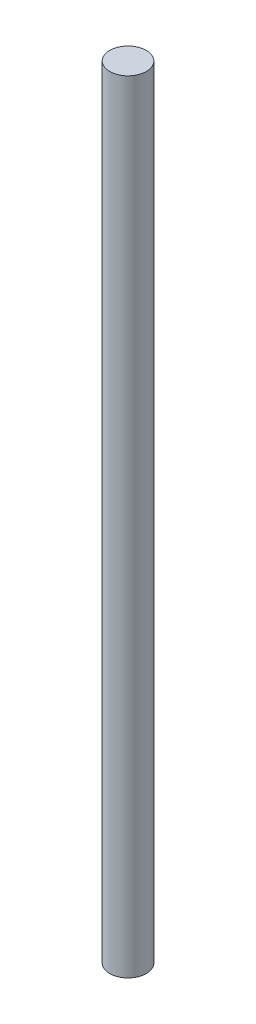
ISO-10303-21;
HEADER;
FILE_DESCRIPTION(('STEP AP214'),'2;1');
FILE_NAME('part.step','',(''),(''),'','','');
FILE_SCHEMA(('AUTOMOTIVE_DESIGN { 1 0 10303 214 1 1 1 1 }'));
ENDSEC;
DATA;
#1=APPLICATION_CONTEXT('core data for automotive mechanical design processes');
#2=APPLICATION_PROTOCOL_DEFINITION('international standard','automotive_design',2000,#1);
#3=PRODUCT_CONTEXT('',#1,'mechanical');
#4=PRODUCT('Part','Part','',(#3));
#5=PRODUCT_RELATED_PRODUCT_CATEGORY('part','',(#4));
#6=PRODUCT_DEFINITION_FORMATION('','',#4);
#7=PRODUCT_DEFINITION_CONTEXT('part definition',#1,'design');
#8=PRODUCT_DEFINITION('design','',#6,#7);
#9=PRODUCT_DEFINITION_SHAPE('','',#8);
#10=(LENGTH_UNIT() NAMED_UNIT(*) SI_UNIT(.MILLI.,.METRE.));
#11=(NAMED_UNIT(*) PLANE_ANGLE_UNIT() SI_UNIT($,.RADIAN.));
#12=(NAMED_UNIT(*) SI_UNIT($,.STERADIAN.) SOLID_ANGLE_UNIT());
#13=UNCERTAINTY_MEASURE_WITH_UNIT(LENGTH_MEASURE(1.E-05),#10,'distance_accuracy_value','');
#14=(GEOMETRIC_REPRESENTATION_CONTEXT(3) GLOBAL_UNCERTAINTY_ASSIGNED_CONTEXT((#13)) GLOBAL_UNIT_ASSIGNED_CONTEXT((#10,
#11,#12)) REPRESENTATION_CONTEXT('',''));
#15=CARTESIAN_POINT('',(0.,0.,0.));
#16=DIRECTION('',(0.,0.,1.));
#17=DIRECTION('',(1.,0.,0.));
#18=AXIS2_PLACEMENT_3D('',#15,#16,#17);
#19=CARTESIAN_POINT('',(0.,0.,0.));
#20=DIRECTION('',(0.,1.,0.));
#21=DIRECTION('',(0.,0.,1.));
#22=AXIS2_PLACEMENT_3D('',#19,#20,#21);
#23=PLANE('',#22);
#24=CARTESIAN_POINT('',(0.,0.,0.));
#25=DIRECTION('',(0.,-1.,0.));
#26=DIRECTION('',(0.,0.,-1.));
#27=AXIS2_PLACEMENT_3D('',#24,#25,#26);
#28=CIRCLE('',#27,1.1);
#29=CARTESIAN_POINT('',(0.,0.,-1.1));
#30=VERTEX_POINT('',#29);
#31=EDGE_CURVE('E10',#30,#30,#28,.T.);
#32=ORIENTED_EDGE('',*,*,#31,.F.);
#33=EDGE_LOOP('',(#32));
#34=FACE_BOUND('',#33,.T.);
#35=ADVANCED_FACE('F31',(#34),#23,.T.);
#36=CARTESIAN_POINT('',(0.,-51.,0.));
#37=DIRECTION('',(0.,-1.,0.));
#38=DIRECTION('',(0.,0.,-1.));
#39=AXIS2_PLACEMENT_3D('',#36,#37,#38);
#40=CYLINDRICAL_SURFACE('',#39,1.1);
#41=ORIENTED_EDGE('',*,*,#31,.T.);
#42=EDGE_LOOP('',(#41));
#43=FACE_BOUND('',#42,.T.);
#44=CARTESIAN_POINT('',(0.,-47.,0.));
#45=DIRECTION('',(0.,-1.,0.));
#46=DIRECTION('',(0.,0.,-1.));
#47=AXIS2_PLACEMENT_3D('',#44,#45,#46);
#48=CIRCLE('',#47,1.1);
#49=CARTESIAN_POINT('',(0.,-47.,-1.1));
#50=VERTEX_POINT('',#49);
#51=EDGE_CURVE('E37',#50,#50,#48,.T.);
#52=ORIENTED_EDGE('',*,*,#51,.F.);
#53=EDGE_LOOP('',(#52));
#54=FACE_BOUND('',#53,.T.);
#55=ADVANCED_FACE('F45',(#43,#54),#40,.T.);
#56=CARTESIAN_POINT('',(1.1,-47.,0.));
#57=DIRECTION('',(0.,-1.,0.));
#58=DIRECTION('',(0.,0.,-1.));
#59=AXIS2_PLACEMENT_3D('',#56,#57,#58);
#60=PLANE('',#59);
#61=ORIENTED_EDGE('',*,*,#51,.T.);
#62=EDGE_LOOP('',(#61));
#63=FACE_BOUND('',#62,.T.);
#64=ADVANCED_FACE('F43',(#63),#60,.T.);
#65=CLOSED_SHELL('',(#35,#55,#64));
#66=MANIFOLD_SOLID_BREP('B2',#65);
#67=ADVANCED_BREP_SHAPE_REPRESENTATION('',(#18,#66),#14);
#68=SHAPE_DEFINITION_REPRESENTATION(#9,#67);
ENDSEC;
END-ISO-10303-21;
